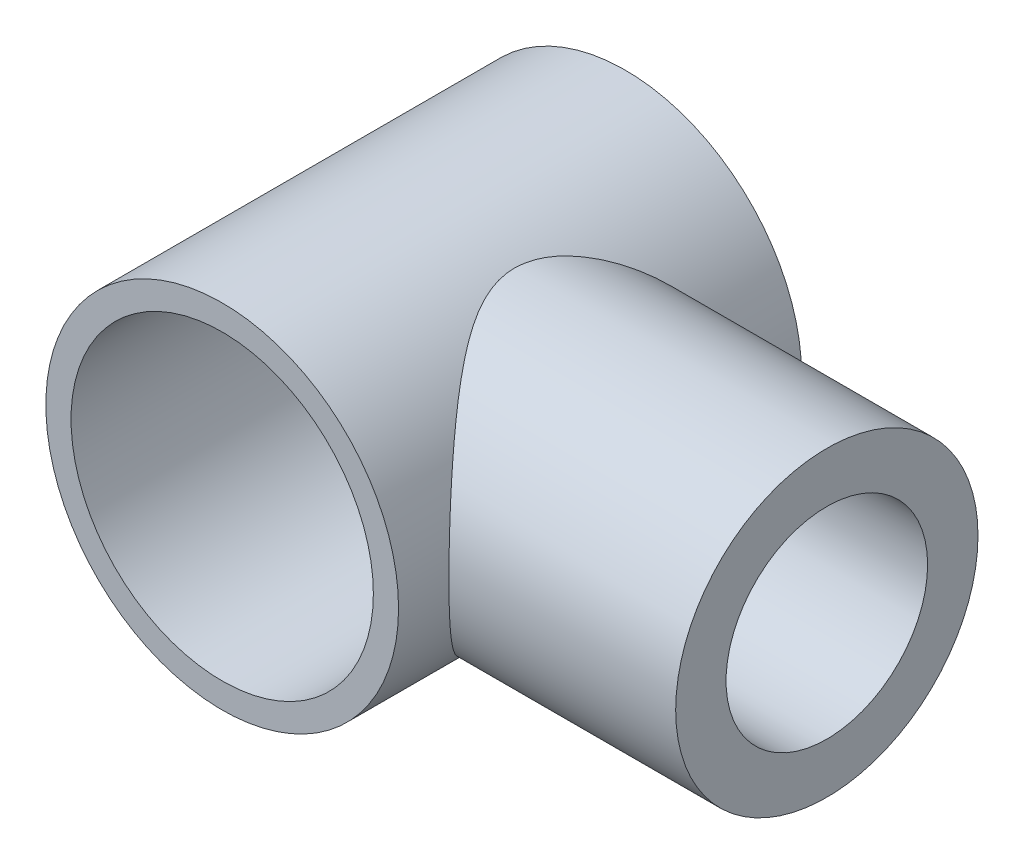
ISO-10303-21;
HEADER;
FILE_DESCRIPTION(('STEP AP214'),'2;1');
FILE_NAME('part.step','',(''),(''),'','','');
FILE_SCHEMA(('AUTOMOTIVE_DESIGN { 1 0 10303 214 1 1 1 1 }'));
ENDSEC;
DATA;
#1=APPLICATION_CONTEXT('core data for automotive mechanical design processes');
#2=APPLICATION_PROTOCOL_DEFINITION('international standard','automotive_design',2000,#1);
#3=PRODUCT_CONTEXT('',#1,'mechanical');
#4=PRODUCT('Part','Part','',(#3));
#5=PRODUCT_RELATED_PRODUCT_CATEGORY('part','',(#4));
#6=PRODUCT_DEFINITION_FORMATION('','',#4);
#7=PRODUCT_DEFINITION_CONTEXT('part definition',#1,'design');
#8=PRODUCT_DEFINITION('design','',#6,#7);
#9=PRODUCT_DEFINITION_SHAPE('','',#8);
#10=(LENGTH_UNIT() NAMED_UNIT(*) SI_UNIT(.MILLI.,.METRE.));
#11=(NAMED_UNIT(*) PLANE_ANGLE_UNIT() SI_UNIT($,.RADIAN.));
#12=(NAMED_UNIT(*) SI_UNIT($,.STERADIAN.) SOLID_ANGLE_UNIT());
#13=UNCERTAINTY_MEASURE_WITH_UNIT(LENGTH_MEASURE(1.E-05),#10,'distance_accuracy_value','');
#14=(GEOMETRIC_REPRESENTATION_CONTEXT(3) GLOBAL_UNCERTAINTY_ASSIGNED_CONTEXT((#13)) GLOBAL_UNIT_ASSIGNED_CONTEXT((#10,
#11,#12)) REPRESENTATION_CONTEXT('',''));
#15=CARTESIAN_POINT('',(0.,0.,0.));
#16=DIRECTION('',(0.,0.,1.));
#17=DIRECTION('',(1.,0.,0.));
#18=AXIS2_PLACEMENT_3D('',#15,#16,#17);
#19=CARTESIAN_POINT('',(50.8,0.,0.));
#20=DIRECTION('',(-1.,0.,0.));
#21=DIRECTION('',(0.,0.,1.));
#22=AXIS2_PLACEMENT_3D('',#19,#20,#21);
#23=CYLINDRICAL_SURFACE('',#22,19.05);
#24=CARTESIAN_POINT('',(50.8,0.,0.));
#25=DIRECTION('',(1.,0.,0.));
#26=DIRECTION('',(0.,0.,-1.));
#27=AXIS2_PLACEMENT_3D('',#24,#25,#26);
#28=CIRCLE('',#27,19.05);
#29=CARTESIAN_POINT('',(50.8,0.,-19.05));
#30=VERTEX_POINT('',#29);
#31=EDGE_CURVE('E52',#30,#30,#28,.T.);
#32=ORIENTED_EDGE('',*,*,#31,.F.);
#33=EDGE_LOOP('',(#32));
#34=FACE_BOUND('',#33,.T.);
#35=CARTESIAN_POINT('',(22.225,0.,19.05));
#36=CARTESIAN_POINT('',(22.2249963510652,0.448563703535865,19.0499962681765));
#37=CARTESIAN_POINT('',(22.2113899679366,0.897189152138415,19.0341270225542));
#38=CARTESIAN_POINT('',(22.1572721033992,1.79062148804766,18.9709472965141));
#39=CARTESIAN_POINT('',(22.1167556248665,2.23542765058187,18.9236309764678));
#40=CARTESIAN_POINT('',(22.0097060527991,3.11787786363935,18.7984066168343));
#41=CARTESIAN_POINT('',(21.9431526317819,3.55551603918132,18.7204746749133));
#42=CARTESIAN_POINT('',(21.7854826169591,4.42000646916787,18.5354113126392));
#43=CARTESIAN_POINT('',(21.6943665939284,4.84685897399305,18.4282805707944));
#44=CARTESIAN_POINT('',(21.4900564570249,5.68443309918823,18.187315756837));
#45=CARTESIAN_POINT('',(21.3770044632264,6.09523912970324,18.053653457166));
#46=CARTESIAN_POINT('',(21.1305208043592,6.90140642309321,17.7611089233733));
#47=CARTESIAN_POINT('',(20.9970894538204,7.29676792421692,17.6022270784822));
#48=CARTESIAN_POINT('',(20.712014826878,8.07050639937623,17.2611760810917));
#49=CARTESIAN_POINT('',(20.5603702546023,8.44888216224095,17.0790052715213));
#50=CARTESIAN_POINT('',(20.2410764396617,9.18757007987839,16.6932548296511));
#51=CARTESIAN_POINT('',(20.0734237206864,9.54787828509391,16.4896705462471));
#52=CARTESIAN_POINT('',(19.658060683619,10.3828441818933,15.9818641214663));
#53=CARTESIAN_POINT('',(19.4041073632835,10.8490278480277,15.6687627167791));
#54=CARTESIAN_POINT('',(18.8755029884987,11.7446423151025,15.0091783599816));
#55=CARTESIAN_POINT('',(18.6008446747211,12.17406011189,14.6626836879707));
#56=CARTESIAN_POINT('',(18.0356245352995,12.9967886032243,13.9386865019689));
#57=CARTESIAN_POINT('',(17.7450262023869,13.3900103743175,13.5611117241623));
#58=CARTESIAN_POINT('',(17.1540033282107,14.1392511095508,12.7780181427311));
#59=CARTESIAN_POINT('',(16.8535800828858,14.4952749544422,12.3725030167843));
#60=CARTESIAN_POINT('',(16.2424062033248,15.1772421870853,11.5262803882765));
#61=CARTESIAN_POINT('',(15.9315696807841,15.5024292728783,11.0850260290406));
#62=CARTESIAN_POINT('',(15.3122180874907,16.114468517878,10.1748369565258));
#63=CARTESIAN_POINT('',(15.0037038115743,16.401308068869,9.70589321200692));
#64=CARTESIAN_POINT('',(14.3980991524055,16.9354056781552,8.7406109920939));
#65=CARTESIAN_POINT('',(14.1009859885895,17.1827461647377,8.24433255158797));
#66=CARTESIAN_POINT('',(13.528556687588,17.636944703405,7.22173120423745));
#67=CARTESIAN_POINT('',(13.253223079006,17.8438354041785,6.69543297456324));
#68=CARTESIAN_POINT('',(12.8608078238047,18.1267327527172,5.86647816666379));
#69=CARTESIAN_POINT('',(12.7303481706489,18.2184393103615,5.57545172985251));
#70=CARTESIAN_POINT('',(12.4826481344027,18.3890369388024,4.98403133879362));
#71=CARTESIAN_POINT('',(12.3654095867936,18.4679262308514,4.68363609124928));
#72=CARTESIAN_POINT('',(12.1476571278415,18.6118804054173,4.07409992588955));
#73=CARTESIAN_POINT('',(12.047117438432,18.6769666395725,3.76497336634904));
#74=CARTESIAN_POINT('',(11.8662151944698,18.792421164367,3.13828511556138));
#75=CARTESIAN_POINT('',(11.7858418612479,18.8427973197311,2.82072803112753));
#76=CARTESIAN_POINT('',(11.6477452551469,18.9284814238064,2.17332105743714));
#77=CARTESIAN_POINT('',(11.5903982605838,18.9635398148935,1.84335636675644));
#78=CARTESIAN_POINT('',(11.5033999950561,19.0164415189307,1.17840105169739));
#79=CARTESIAN_POINT('',(11.4737454379175,19.0342868745056,0.843411028454214));
#80=CARTESIAN_POINT('',(11.4440074651122,19.0521818755503,0.17192057478469));
#81=CARTESIAN_POINT('',(11.4438978876302,19.0522472650215,-0.164578255519678));
#82=CARTESIAN_POINT('',(11.4731974290653,19.0346171667709,-0.835800549840466));
#83=CARTESIAN_POINT('',(11.5026060679888,19.0169219678528,-1.17052404263654));
#84=CARTESIAN_POINT('',(11.5823977196988,18.9684066016985,-1.7836972156989));
#85=CARTESIAN_POINT('',(11.6288496592692,18.9400295434889,-2.06286919974233));
#86=CARTESIAN_POINT('',(11.7396419616693,18.8715572973168,-2.61622265929752));
#87=CARTESIAN_POINT('',(11.8039887737942,18.8314578843616,-2.89040229754347));
#88=CARTESIAN_POINT('',(12.0207046075918,18.6944496125996,-3.70444010265541));
#89=CARTESIAN_POINT('',(12.1966805342794,18.5808701183469,-4.23532160156338));
#90=CARTESIAN_POINT('',(12.5756582873144,18.3262320245863,-5.22395215945325));
#91=CARTESIAN_POINT('',(12.7749617181848,18.1884362289949,-5.68404039904576));
#92=CARTESIAN_POINT('',(13.1991677618079,17.8829804029984,-6.58229165421004));
#93=CARTESIAN_POINT('',(13.4240903883106,17.7152969657659,-7.02043713805356));
#94=CARTESIAN_POINT('',(13.8910508285684,17.3515757356333,-7.8766914608841));
#95=CARTESIAN_POINT('',(14.1331285270308,17.1554706797752,-8.29474954484415));
#96=CARTESIAN_POINT('',(14.6270566375729,16.7363314171061,-9.11087456612661));
#97=CARTESIAN_POINT('',(14.8789046060304,16.5133039147197,-9.5089464457408));
#98=CARTESIAN_POINT('',(15.4077195319539,16.0216571192137,-10.3174921810685));
#99=CARTESIAN_POINT('',(15.6850690253758,15.750808338944,-10.7263597521015));
#100=CARTESIAN_POINT('',(16.2396571954695,15.1783745757433,-11.5221378204265));
#101=CARTESIAN_POINT('',(16.5168958572486,14.8767863324173,-11.9090459817941));
#102=CARTESIAN_POINT('',(17.0662997426743,14.2431634176716,-12.6600103065588));
#103=CARTESIAN_POINT('',(17.3384701332829,13.9111620567677,-13.0240907530513));
#104=CARTESIAN_POINT('',(17.8737893298288,13.2163015826379,-13.7286795053856));
#105=CARTESIAN_POINT('',(18.1369388898896,12.8534450577127,-14.0691897840844));
#106=CARTESIAN_POINT('',(18.6372201291738,12.1158212052285,-14.7083428006703));
#107=CARTESIAN_POINT('',(18.8749947122247,11.7425714223872,-15.0082300126255));
#108=CARTESIAN_POINT('',(19.335187715752,10.9683171296682,-15.583035753552));
#109=CARTESIAN_POINT('',(19.5576056544783,10.5673117498653,-15.8579534992971));
#110=CARTESIAN_POINT('',(19.9833199390026,9.73829593620121,-16.3801031556805));
#111=CARTESIAN_POINT('',(20.1866287775329,9.31030345555637,-16.6273531747609));
#112=CARTESIAN_POINT('',(20.4744573428778,8.64899189767862,-16.9752614565721));
#113=CARTESIAN_POINT('',(20.5675408176442,8.425344171794,-17.0873988073562));
#114=CARTESIAN_POINT('',(20.7475764959237,7.97171597230317,-17.3036817025003));
#115=CARTESIAN_POINT('',(20.8345271003042,7.74173386859926,-17.4078251630911));
#116=CARTESIAN_POINT('',(21.0558476766709,7.12515973212647,-17.6722583391836));
#117=CARTESIAN_POINT('',(21.1845577264888,6.73338795245934,-17.8253494029047));
#118=CARTESIAN_POINT('',(21.4218847624416,5.93521727633252,-18.1067593796727));
#119=CARTESIAN_POINT('',(21.5305056620195,5.52882124719761,-18.2350831177017));
#120=CARTESIAN_POINT('',(21.725710775026,4.70358998876465,-18.4651588492769));
#121=CARTESIAN_POINT('',(21.8123060951188,4.28476114832549,-18.5669242358694));
#122=CARTESIAN_POINT('',(21.9618382483905,3.43707716866783,-18.742367006478));
#123=CARTESIAN_POINT('',(22.0247748441818,3.00822192889208,-18.8160441086613));
#124=CARTESIAN_POINT('',(22.1259031330844,2.14154874604599,-18.9343183517505));
#125=CARTESIAN_POINT('',(22.1639783276702,1.70369838482268,-18.9787785909363));
#126=CARTESIAN_POINT('',(22.2140663771637,0.824472530247733,-19.0372489740817));
#127=CARTESIAN_POINT('',(22.2260791663226,0.383097028005887,-19.0512590412234));
#128=CARTESIAN_POINT('',(22.2237684769626,-0.499477819681567,-19.0485632091656));
#129=CARTESIAN_POINT('',(22.2094456247948,-0.94067716906707,-19.031858040479));
#130=CARTESIAN_POINT('',(22.1547903738637,-1.8192257742203,-18.9680490086781));
#131=CARTESIAN_POINT('',(22.1144590097153,-2.25657518243664,-18.9209463547712));
#132=CARTESIAN_POINT('',(22.0125608315837,-3.09222189892728,-18.8017442542838));
#133=CARTESIAN_POINT('',(21.9527626911999,-3.49103611355891,-18.7317247669453));
#134=CARTESIAN_POINT('',(21.8126893418756,-4.27991674572959,-18.5673676035051));
#135=CARTESIAN_POINT('',(21.7324153618196,-4.66998368671991,-18.4730313868005));
#136=CARTESIAN_POINT('',(21.552743689174,-5.43929452393457,-18.2613189420487));
#137=CARTESIAN_POINT('',(21.4533451844587,-5.81853795975161,-18.1439417355585));
#138=CARTESIAN_POINT('',(21.236972131825,-6.56448701151628,-17.8875818592715));
#139=CARTESIAN_POINT('',(21.1199964841095,-6.93119184116297,-17.7485978375233));
#140=CARTESIAN_POINT('',(20.8600061828521,-7.67985967289831,-17.4384476205953));
#141=CARTESIAN_POINT('',(20.7156500054905,-8.06065362266362,-17.265586759562));
#142=CARTESIAN_POINT('',(20.4104950150152,-8.80477538921098,-16.8982435913781));
#143=CARTESIAN_POINT('',(20.249695758628,-9.16810273473895,-16.7037607013274));
#144=CARTESIAN_POINT('',(19.9137115507011,-9.87666592894649,-16.2948269442224));
#145=CARTESIAN_POINT('',(19.7385190521258,-10.2218921289426,-16.0803655935543));
#146=CARTESIAN_POINT('',(19.375912366701,-10.8935940082,-15.6331369757212));
#147=CARTESIAN_POINT('',(19.1884957125362,-11.2200658769348,-15.400366010991));
#148=CARTESIAN_POINT('',(18.7064441696691,-12.0137645790509,-14.7963132831968));
#149=CARTESIAN_POINT('',(18.4053736447526,-12.469013152051,-14.4143443622767));
#150=CARTESIAN_POINT('',(17.786982369731,-13.3363325396783,-13.6158917046143));
#151=CARTESIAN_POINT('',(17.469654067546,-13.748383012134,-13.1993918709698));
#152=CARTESIAN_POINT('',(16.825038142109,-14.5301704699835,-12.3335949201064));
#153=CARTESIAN_POINT('',(16.4977315199918,-14.8998194086659,-11.8842326209638));
#154=CARTESIAN_POINT('',(15.8412781188537,-15.5959336681889,-10.9547481843057));
#155=CARTESIAN_POINT('',(15.5121319702853,-15.9224129392521,-10.4746360583677));
#156=CARTESIAN_POINT('',(14.9352703839703,-16.4622832249793,-9.59671781504496));
#157=CARTESIAN_POINT('',(14.6861523042259,-16.68445882894,-9.2052098869425));
#158=CARTESIAN_POINT('',(14.1969874386344,-17.1026206338377,-8.40283547349731));
#159=CARTESIAN_POINT('',(13.9569419182219,-17.2986031909835,-7.99196630548697));
#160=CARTESIAN_POINT('',(13.4929125897518,-17.6629183470738,-7.15075516249884));
#161=CARTESIAN_POINT('',(13.2688909033422,-17.8313174547096,-6.72046331599746));
#162=CARTESIAN_POINT('',(12.8447557806373,-18.1392254505354,-5.83859886533086));
#163=CARTESIAN_POINT('',(12.6446274848692,-18.2787523345814,-5.3870397337157));
#164=CARTESIAN_POINT('',(12.2381453219272,-18.5540121987693,-4.35813654347652));
#165=CARTESIAN_POINT('',(12.0402798762374,-18.6820206213681,-3.77512954158565));
#166=CARTESIAN_POINT('',(11.8006726115699,-18.8335801237832,-2.87930828732603));
#167=CARTESIAN_POINT('',(11.7303700258849,-18.8773381884337,-2.57740872619462));
#168=CARTESIAN_POINT('',(11.6116324686458,-18.9506067671227,-1.96754236791002));
#169=CARTESIAN_POINT('',(11.5631966778349,-18.98011781494,-1.65957579851334));
#170=CARTESIAN_POINT('',(11.4902458286574,-19.0243725717596,-1.03648067165628));
#171=CARTESIAN_POINT('',(11.4659835759472,-19.038960254362,-0.721310976584323));
#172=CARTESIAN_POINT('',(11.4436269483862,-19.0524068203758,-0.089709602520213));
#173=CARTESIAN_POINT('',(11.4455310926831,-19.0512665938873,0.226722004042507));
#174=CARTESIAN_POINT('',(11.4754073331094,-19.0332851516952,0.858136705012175));
#175=CARTESIAN_POINT('',(11.5034002229676,-19.0164314117155,1.17311844254743));
#176=CARTESIAN_POINT('',(11.5839189363464,-18.9674887930959,1.79871699996022));
#177=CARTESIAN_POINT('',(11.6364488524906,-18.9353973728906,2.10933308276736));
#178=CARTESIAN_POINT('',(11.775524758836,-18.8492845581772,2.78262783868595));
#179=CARTESIAN_POINT('',(11.86664016503,-18.7922531040758,3.14397250738528));
#180=CARTESIAN_POINT('',(12.0746525688286,-18.6592755990207,3.85552732342316));
#181=CARTESIAN_POINT('',(12.1915569558233,-18.5833241260525,4.2057342464579));
#182=CARTESIAN_POINT('',(12.4462192128305,-18.4137363712745,4.89522811201662));
#183=CARTESIAN_POINT('',(12.5840385782907,-18.3200477295977,5.23447915104726));
#184=CARTESIAN_POINT('',(12.8755463803548,-18.1163630945112,5.90095825647749));
#185=CARTESIAN_POINT('',(13.0292355516934,-18.0063663459716,6.22818576526408));
#186=CARTESIAN_POINT('',(13.4560125816411,-17.6916957995886,7.08766036688553));
#187=CARTESIAN_POINT('',(13.7397989137998,-17.4731534838867,7.60954951280721));
#188=CARTESIAN_POINT('',(14.3262557561536,-16.9956596051598,8.62347005610092));
#189=CARTESIAN_POINT('',(14.6289381913608,-16.7366823664141,9.11548220428888));
#190=CARTESIAN_POINT('',(15.243219131411,-16.1792213479137,10.0718386848146));
#191=CARTESIAN_POINT('',(15.5548291199286,-15.880684712931,10.5361447738523));
#192=CARTESIAN_POINT('',(16.1785019361547,-15.2448385772202,11.4368340855829));
#193=CARTESIAN_POINT('',(16.4905646433416,-14.9075380025126,11.8732237006098));
#194=CARTESIAN_POINT('',(17.12365986282,-14.1765975265133,12.7382325545377));
#195=CARTESIAN_POINT('',(17.4443886267531,-13.7810133664348,13.1654373115905));
#196=CARTESIAN_POINT('',(18.0722508199811,-12.9467030064155,13.9867113604958));
#197=CARTESIAN_POINT('',(18.3793815556676,-12.507968313822,14.3807741010917));
#198=CARTESIAN_POINT('',(18.972605709552,-11.5883291178875,15.1315699807292));
#199=CARTESIAN_POINT('',(19.2587470904351,-11.1075266358208,15.4883890685121));
#200=CARTESIAN_POINT('',(19.66741553588,-10.354946741676,15.9927717682558));
#201=CARTESIAN_POINT('',(19.8001953097737,-10.0988997851152,16.1557353387449));
#202=CARTESIAN_POINT('',(20.0581240744088,-9.57638613058905,16.4708354914515));
#203=CARTESIAN_POINT('',(20.1832713041667,-9.30991705112914,16.6229695764293));
#204=CARTESIAN_POINT('',(20.4711977636986,-8.66310488009764,16.9715888241881));
#205=CARTESIAN_POINT('',(20.6300846990589,-8.27815502240235,17.1628089758884));
#206=CARTESIAN_POINT('',(20.9290453122642,-7.49020610749757,17.5210314588184));
#207=CARTESIAN_POINT('',(21.0691238363296,-7.08721173550466,17.6880400293497));
#208=CARTESIAN_POINT('',(21.327994615724,-6.2651980575774,17.995613834136));
#209=CARTESIAN_POINT('',(21.446812861353,-5.84619908834643,18.1362113660314));
#210=CARTESIAN_POINT('',(21.6611186634393,-4.99394573076896,18.3891395610098));
#211=CARTESIAN_POINT('',(21.7566105557866,-4.56069400873093,18.5014754774631));
#212=CARTESIAN_POINT('',(21.902543254866,-3.78748397260374,18.6728351067213));
#213=CARTESIAN_POINT('',(21.9582969888969,-3.44991096205714,18.7381838802984));
#214=CARTESIAN_POINT('',(22.054444082545,-2.76950407219213,18.8507623223174));
#215=CARTESIAN_POINT('',(22.0948347186931,-2.42666927129426,18.8979887781668));
#216=CARTESIAN_POINT('',(22.1596913990136,-1.73739342002838,18.9737761913043));
#217=CARTESIAN_POINT('',(22.1841553608126,-1.39095190410515,19.0023347078073));
#218=CARTESIAN_POINT('',(22.2168092767771,-0.696352395729682,19.0404459575191));
#219=CARTESIAN_POINT('',(22.2250028324631,-0.348194800247481,19.0500028968049));
#220=CARTESIAN_POINT('',(22.225,0.,19.05));
#221=B_SPLINE_CURVE_WITH_KNOTS('',3,(#35,#36,#37,#38,#39,#40,#41,#42,#43,#44,#45,#46,#47,#48,
#49,#50,#51,#52,#53,#54,#55,#56,#57,#58,#59,#60,#61,#62,#63,#64,#65,#66,#67,#68,#69,#70,#71,#72,
#73,#74,#75,#76,#77,#78,#79,#80,#81,#82,#83,#84,#85,#86,#87,#88,#89,#90,#91,#92,#93,#94,#95,#96,
#97,#98,#99,#100,#101,#102,#103,#104,#105,#106,#107,#108,#109,#110,#111,#112,#113,#114,#115,
#116,#117,#118,#119,#120,#121,#122,#123,#124,#125,#126,#127,#128,#129,#130,#131,#132,#133,#134,
#135,#136,#137,#138,#139,#140,#141,#142,#143,#144,#145,#146,#147,#148,#149,#150,#151,#152,#153,
#154,#155,#156,#157,#158,#159,#160,#161,#162,#163,#164,#165,#166,#167,#168,#169,#170,#171,#172,
#173,#174,#175,#176,#177,#178,#179,#180,#181,#182,#183,#184,#185,#186,#187,#188,#189,#190,#191,
#192,#193,#194,#195,#196,#197,#198,#199,#200,#201,#202,#203,#204,#205,#206,#207,#208,#209,#210,
#211,#212,#213,#214,#215,#216,#217,#218,#219,#220),.UNSPECIFIED.,.T.,.F.,(4,2,2,2,2,2,2,2,2,2,2,
2,2,2,2,2,2,2,2,2,2,2,2,2,2,2,2,2,2,2,2,2,2,2,2,2,2,2,2,2,2,2,2,2,2,2,2,2,2,2,2,2,2,2,2,2,2,2,2,
2,2,2,2,2,2,2,2,2,2,2,2,2,2,2,2,2,2,2,2,2,2,2,2,2,2,2,2,2,2,2,2,2,4),(0.,1.34531639816823,
2.69088268743035,4.03750158626212,5.38408919565445,6.72222741409177,8.06034498212703,
9.39855781379145,10.7370619139886,12.58334301784,14.430274479786,16.2816285582196,
18.1327394140481,20.0213843685889,21.9106487680491,23.7959175442687,25.6796583028112,
26.674699916367,27.6698795015591,28.6635082524103,29.6566047841425,30.6653268995963,
31.6739292979664,32.6816385849971,33.6893314860126,34.5417200966524,35.3944163063443,
37.1012408970593,38.6591226340686,40.2182298470916,41.7810890118098,43.3435597817052,
45.0325635363556,46.7217466227414,48.4091012306678,50.0963144333809,51.6986478598523,
53.3010315299544,54.9023602339012,55.7029564192035,56.5037605923352,57.8219700423291,
59.1399224290041,60.4572088987778,61.7745085856185,63.0979375581845,64.4213698694194,
65.744770705343,67.0681188998239,68.2946890244679,69.521185552201,70.7477341747818,
71.9743595741675,73.3003142277406,74.6263046359034,75.9529948141233,77.2799536042434,
79.2756269339225,81.2722358529638,83.272918417332,85.272952875398,86.8154347261415,
88.3581309331821,89.8970508477013,91.4350086555852,93.3145303402376,94.2527355039131,
95.1909055140735,96.1387869958929,97.086614833844,98.0351987735264,98.9839409876488,
100.113126065117,101.242635112433,102.375531965995,103.508481293555,105.404508045784,
107.301743687155,109.201540273182,111.100900273715,113.092800038307,115.085092625263,
117.07268083737,118.066165164593,119.059877848459,120.43328703126,121.806341656278,
123.177706105295,124.548815451518,125.593018672542,126.637406916883,127.681931685006,
128.726225217535),.UNSPECIFIED.);
#222=CARTESIAN_POINT('',(22.225,0.,19.05));
#223=VERTEX_POINT('',#222);
#224=EDGE_CURVE('E10',#223,#223,#221,.T.);
#225=ORIENTED_EDGE('',*,*,#224,.F.);
#226=EDGE_LOOP('',(#225));
#227=FACE_BOUND('',#226,.T.);
#228=ADVANCED_FACE('F39',(#34,#227),#23,.T.);
#229=CARTESIAN_POINT('',(50.8,0.,0.));
#230=DIRECTION('',(-1.,0.,0.));
#231=DIRECTION('',(0.,0.,1.));
#232=AXIS2_PLACEMENT_3D('',#229,#230,#231);
#233=CYLINDRICAL_SURFACE('',#232,12.7);
#234=CARTESIAN_POINT('',(50.8,0.,0.));
#235=DIRECTION('',(1.,0.,0.));
#236=DIRECTION('',(0.,0.,-1.));
#237=AXIS2_PLACEMENT_3D('',#234,#235,#236);
#238=CIRCLE('',#237,12.7);
#239=CARTESIAN_POINT('',(50.8,0.,-12.7));
#240=VERTEX_POINT('',#239);
#241=EDGE_CURVE('E57',#240,#240,#238,.T.);
#242=ORIENTED_EDGE('',*,*,#241,.T.);
#243=EDGE_LOOP('',(#242));
#244=FACE_BOUND('',#243,.T.);
#245=CARTESIAN_POINT('',(19.05,0.,-12.7));
#246=CARTESIAN_POINT('',(19.0499999149557,-0.319044351827433,-12.6999999178946));
#247=CARTESIAN_POINT('',(19.041968060588,-0.638090286445418,-12.6879616001765));
#248=CARTESIAN_POINT('',(19.0100429113742,-1.27357416889368,-12.6399980296532));
#249=CARTESIAN_POINT('',(18.9861495330445,-1.59001210298844,-12.6040726511236));
#250=CARTESIAN_POINT('',(18.9230795112656,-2.21792085178076,-12.5088651833196));
#251=CARTESIAN_POINT('',(18.8838969102271,-2.52938968091531,-12.4495739892458));
#252=CARTESIAN_POINT('',(18.7911802647186,-3.14498780586516,-12.3084840957078));
#253=CARTESIAN_POINT('',(18.7376460467142,-3.44911701288404,-12.2266851240877));
#254=CARTESIAN_POINT('',(18.6177206611583,-4.04665380134025,-12.042089505447));
#255=CARTESIAN_POINT('',(18.551392136999,-4.34010566223851,-11.9393950376442));
#256=CARTESIAN_POINT('',(18.4071052568794,-4.91621490193225,-11.7139457330231));
#257=CARTESIAN_POINT('',(18.3291469610881,-5.19887233656537,-11.5911909999903));
#258=CARTESIAN_POINT('',(18.1631367051315,-5.75207432701854,-11.3268535757942));
#259=CARTESIAN_POINT('',(18.0750863641369,-6.02262081626361,-11.1852739043278));
#260=CARTESIAN_POINT('',(17.890458352108,-6.55074759818101,-10.8843977456393));
#261=CARTESIAN_POINT('',(17.7938775100723,-6.80832301284097,-10.7250946644196));
#262=CARTESIAN_POINT('',(17.5854082661757,-7.33086574145447,-10.3757108500479));
#263=CARTESIAN_POINT('',(17.4729161377666,-7.59461321173192,-10.1841663070463));
#264=CARTESIAN_POINT('',(17.2420675803482,-8.10506530257835,-9.78280879055701));
#265=CARTESIAN_POINT('',(17.1237109886303,-8.35176944982775,-9.57299531007802));
#266=CARTESIAN_POINT('',(16.8831992824099,-8.82787123192345,-9.13582470289683));
#267=CARTESIAN_POINT('',(16.7610388349219,-9.05724286741398,-8.90844221631568));
#268=CARTESIAN_POINT('',(16.5154631225222,-9.49765992068987,-8.43732333395075));
#269=CARTESIAN_POINT('',(16.3920481088713,-9.70870893033224,-8.19359016013983));
#270=CARTESIAN_POINT('',(16.1269912795642,-10.1438339769357,-7.65062453984433));
#271=CARTESIAN_POINT('',(15.9855513078686,-10.3646977289022,-7.34870853652963));
#272=CARTESIAN_POINT('',(15.7084356410373,-10.7800697399961,-6.7246282637438));
#273=CARTESIAN_POINT('',(15.5727612595663,-10.9745720146433,-6.4024594207697));
#274=CARTESIAN_POINT('',(15.3120771580104,-11.3354426882506,-5.73933798824068));
#275=CARTESIAN_POINT('',(15.1870504300321,-11.5018563882181,-5.39841684299923));
#276=CARTESIAN_POINT('',(14.9525421661918,-11.8051159191697,-4.69836689520345));
#277=CARTESIAN_POINT('',(14.8430611914586,-11.9419606829468,-4.33923743604889));
#278=CARTESIAN_POINT('',(14.6737887971171,-12.148859028084,-3.71090841112694));
#279=CARTESIAN_POINT('',(14.6087779778262,-12.2267886352654,-3.44568727600369));
#280=CARTESIAN_POINT('',(14.4914306450491,-12.3656463418972,-2.90822033819586));
#281=CARTESIAN_POINT('',(14.4390859954181,-12.4265853591448,-2.63597916989363));
#282=CARTESIAN_POINT('',(14.348894521881,-12.5306215699129,-2.08607784405444));
#283=CARTESIAN_POINT('',(14.3110297415313,-12.5737408670083,-1.80842484995687));
#284=CARTESIAN_POINT('',(14.2511622433023,-12.6415558604093,-1.24915768342005));
#285=CARTESIAN_POINT('',(14.2291596123524,-12.6662514557473,-0.967543489280845));
#286=CARTESIAN_POINT('',(14.2018752005732,-12.6968370696706,-0.401303384389314));
#287=CARTESIAN_POINT('',(14.1966630383679,-12.7026487905648,-0.11666983119373));
#288=CARTESIAN_POINT('',(14.2033816794798,-12.695135759999,0.452139536474313));
#289=CARTESIAN_POINT('',(14.2153125410287,-12.6818109435356,0.736315349388631));
#290=CARTESIAN_POINT('',(14.2558189324113,-12.63625913706,1.30214668238538));
#291=CARTESIAN_POINT('',(14.2844068298005,-12.6040181019651,1.58380017174526));
#292=CARTESIAN_POINT('',(14.357069745187,-12.5211847753435,2.14234802376761));
#293=CARTESIAN_POINT('',(14.4011450585547,-12.470592133821,2.41924229555837));
#294=CARTESIAN_POINT('',(14.5008617434374,-12.3544761806586,2.95440977540902));
#295=CARTESIAN_POINT('',(14.5559009500699,-12.2897177147741,3.21296322499923));
#296=CARTESIAN_POINT('',(14.6769594426603,-12.1448862980872,3.72318316530469));
#297=CARTESIAN_POINT('',(14.7429822780439,-12.0648083954582,3.97484739901302));
#298=CARTESIAN_POINT('',(14.8842370446744,-11.8901049878849,4.47039533264356));
#299=CARTESIAN_POINT('',(14.9594690117088,-11.7954794264068,4.71427900232517));
#300=CARTESIAN_POINT('',(15.1173998256832,-11.592379837334,5.19369955338452));
#301=CARTESIAN_POINT('',(15.2000989778942,-11.4839052434926,5.429236092969));
#302=CARTESIAN_POINT('',(15.3887310058595,-11.2302825549988,5.93863252708919));
#303=CARTESIAN_POINT('',(15.4959665818437,-11.0821640136153,6.21053379024358));
#304=CARTESIAN_POINT('',(15.7161179031399,-10.7676822582035,6.74107683918443));
#305=CARTESIAN_POINT('',(15.829033070871,-10.6013208973393,6.99971996786488));
#306=CARTESIAN_POINT('',(16.058224949471,-10.2508438822787,7.50363220060206));
#307=CARTESIAN_POINT('',(16.1745055279823,-10.0667071827702,7.74888489973563));
#308=CARTESIAN_POINT('',(16.4080174089175,-9.68143701029362,8.22518161231107));
#309=CARTESIAN_POINT('',(16.525248774024,-9.48030240833244,8.45622468019186));
#310=CARTESIAN_POINT('',(16.7837163834044,-9.01633250153976,8.95178685885655));
#311=CARTESIAN_POINT('',(16.9246742415276,-8.74954821141177,9.21277245872227));
#312=CARTESIAN_POINT('',(17.2012588585807,-8.19243189886495,9.71153228264538));
#313=CARTESIAN_POINT('',(17.3368846334086,-7.90209555963249,9.94930223386844));
#314=CARTESIAN_POINT('',(17.5992409697553,-7.29912570388165,10.3997240866172));
#315=CARTESIAN_POINT('',(17.7259780204629,-6.98650879659962,10.6123943911749));
#316=CARTESIAN_POINT('',(17.9673044475892,-6.3401406960209,11.0107509245687));
#317=CARTESIAN_POINT('',(18.0818971641012,-6.00639535429002,11.1964445781125));
#318=CARTESIAN_POINT('',(18.2747724322506,-5.38691504029924,11.5050558516089));
#319=CARTESIAN_POINT('',(18.3557696171759,-5.10459086222092,11.6331440071965));
#320=CARTESIAN_POINT('',(18.5062654001565,-4.52870423339756,11.8691883369684));
#321=CARTESIAN_POINT('',(18.5757661520494,-4.23514390044676,11.9771482826224));
#322=CARTESIAN_POINT('',(18.7017836207441,-3.63850093619584,12.1716760582035));
#323=CARTESIAN_POINT('',(18.7583086014465,-3.33542450604258,12.2582575061615));
#324=CARTESIAN_POINT('',(18.8571698991357,-2.72145399464498,12.4090127689964));
#325=CARTESIAN_POINT('',(18.8995059978573,-2.41055979322018,12.4731862391756));
#326=CARTESIAN_POINT('',(18.9691377632047,-1.78179294641286,12.5784440542206));
#327=CARTESIAN_POINT('',(18.996366833584,-1.46389572546397,12.619426180372));
#328=CARTESIAN_POINT('',(19.034820707395,-0.824941145729576,12.6772381407808));
#329=CARTESIAN_POINT('',(19.0460454899143,-0.503883782815339,12.6940679434791));
#330=CARTESIAN_POINT('',(19.0522045898932,0.13872510760991,12.7033071008558));
#331=CARTESIAN_POINT('',(19.0471395787862,0.460276614207246,12.6957174620559));
#332=CARTESIAN_POINT('',(19.0208492602128,1.101205295587,12.6562405342416));
#333=CARTESIAN_POINT('',(18.9996246424728,1.42058256258358,12.624354282258));
#334=CARTESIAN_POINT('',(18.9436003211899,2.03226782020868,12.5398728558977));
#335=CARTESIAN_POINT('',(18.9098612177051,2.32489890402041,12.4888931992071));
#336=CARTESIAN_POINT('',(18.8295982615718,2.90417350057308,12.3670276605786));
#337=CARTESIAN_POINT('',(18.7830751285296,3.19081734935543,12.2961428990839));
#338=CARTESIAN_POINT('',(18.6781723632704,3.75647970570818,12.1352930726394));
#339=CARTESIAN_POINT('',(18.6197919592089,4.0354977155354,12.0453267655669));
#340=CARTESIAN_POINT('',(18.4922798141388,4.58448654730668,11.8472635358187));
#341=CARTESIAN_POINT('',(18.4231475004616,4.85445688642181,11.7391656473939));
#342=CARTESIAN_POINT('',(18.2708860160936,5.40020940820472,11.4987801736323));
#343=CARTESIAN_POINT('',(18.1871630742086,5.67535503466359,11.3654247712153));
#344=CARTESIAN_POINT('',(18.0105704184074,6.21304645580827,11.0806419221383));
#345=CARTESIAN_POINT('',(17.9177004292693,6.47559187101745,10.9292139316702));
#346=CARTESIAN_POINT('',(17.7244005810022,6.98734375229469,10.6093413686934));
#347=CARTESIAN_POINT('',(17.6239673585761,7.23654419868886,10.4408892141782));
#348=CARTESIAN_POINT('',(17.4172474675302,7.72083737412007,10.0880351728785));
#349=CARTESIAN_POINT('',(17.310960146828,7.95592852541687,9.90363150795997));
#350=CARTESIAN_POINT('',(17.0771108634957,8.44749054584726,9.48941008814649));
#351=CARTESIAN_POINT('',(16.948842477865,8.701463663919,9.25702204660917));
#352=CARTESIAN_POINT('',(16.6895134170715,9.18906491102797,8.77320222586825));
#353=CARTESIAN_POINT('',(16.5584523739016,9.42269033781812,8.5217679255176));
#354=CARTESIAN_POINT('',(16.2963694707963,9.8690353904855,8.00062047574539));
#355=CARTESIAN_POINT('',(16.1653476979281,10.0817407099856,7.73089502784106));
#356=CARTESIAN_POINT('',(15.9065761047634,10.485264507119,7.17408053074526));
#357=CARTESIAN_POINT('',(15.7788259513026,10.6760852203047,6.88699325967969));
#358=CARTESIAN_POINT('',(15.540546962403,11.0197028233684,6.32109654465643));
#359=CARTESIAN_POINT('',(15.4294753422065,11.1743505461842,6.04363978612872));
#360=CARTESIAN_POINT('',(15.2158323601733,11.4635626931769,5.47525270261565));
#361=CARTESIAN_POINT('',(15.1132611214871,11.5981268264122,5.18432218252211));
#362=CARTESIAN_POINT('',(14.9199086044727,11.8458215660015,4.59020000616477));
#363=CARTESIAN_POINT('',(14.8291101392456,11.9589835304229,4.28702709071961));
#364=CARTESIAN_POINT('',(14.662441550989,12.162757262777,3.66920450079333));
#365=CARTESIAN_POINT('',(14.58656799801,12.2533742131335,3.35455748296747));
#366=CARTESIAN_POINT('',(14.4650085249958,12.3964989415323,2.77302325676894));
#367=CARTESIAN_POINT('',(14.4163477325548,12.4529292409068,2.50772028903094));
#368=CARTESIAN_POINT('',(14.3328687824489,12.5489216869191,1.97195047985068));
#369=CARTESIAN_POINT('',(14.2980478266529,12.5884872433794,1.70148469382527));
#370=CARTESIAN_POINT('',(14.2435454437136,12.6501231298292,1.15728191060356));
#371=CARTESIAN_POINT('',(14.2238506830904,12.6722088685011,0.883548010882763));
#372=CARTESIAN_POINT('',(14.2003241372727,12.6985673478658,0.33453005677485));
#373=CARTESIAN_POINT('',(14.1964925835844,12.7028398285934,0.0592459798232902));
#374=CARTESIAN_POINT('',(14.2048515662273,12.6934916088718,-0.490928206801658));
#375=CARTESIAN_POINT('',(14.2170512489473,12.6798606939026,-0.765818001919353));
#376=CARTESIAN_POINT('',(14.2569974195232,12.6349285104012,-1.31299116239798));
#377=CARTESIAN_POINT('',(14.2847437799291,12.6036273867274,-1.58527454910735));
#378=CARTESIAN_POINT('',(14.3547629579246,12.523820828058,-2.12570191521708));
#379=CARTESIAN_POINT('',(14.3970516246548,12.4752966203752,-2.39384104336818));
#380=CARTESIAN_POINT('',(14.4946700634274,12.3617406007918,-2.92420202631461));
#381=CARTESIAN_POINT('',(14.5500027276897,12.2967051276345,-3.18642255464104));
#382=CARTESIAN_POINT('',(14.6882370013199,12.1314748725769,-3.77268213431228));
#383=CARTESIAN_POINT('',(14.7745561243191,12.0265291636104,-4.09458209031462));
#384=CARTESIAN_POINT('',(14.9616336605759,11.7929800056362,-4.72533757933927));
#385=CARTESIAN_POINT('',(15.0623960523769,11.664370035292,-5.03418948769489));
#386=CARTESIAN_POINT('',(15.2748294262097,11.3847676985939,-5.63807596340378));
#387=CARTESIAN_POINT('',(15.3865120243571,11.2337514077467,-5.93309531230955));
#388=CARTESIAN_POINT('',(15.6173044629006,10.9106240233759,-6.50823246109436));
#389=CARTESIAN_POINT('',(15.7364139108891,10.7385140439026,-6.78835104682867));
#390=CARTESIAN_POINT('',(15.9811861487097,10.3708171200094,-7.33808421448005));
#391=CARTESIAN_POINT('',(16.106928640749,10.1748607935095,-7.60741590487795));
#392=CARTESIAN_POINT('',(16.3599595377092,9.76282141905097,-8.1294461709004));
#393=CARTESIAN_POINT('',(16.4872479909,9.54673774123852,-8.38214422557882));
#394=CARTESIAN_POINT('',(16.740663909855,9.0950398220411,-8.87022167836564));
#395=CARTESIAN_POINT('',(16.8667910528357,8.85942032256478,-9.10559638148308));
#396=CARTESIAN_POINT('',(17.1152748733229,8.36931136011994,-9.55802611274978));
#397=CARTESIAN_POINT('',(17.2376312364538,8.11482032979568,-9.77507961604205));
#398=CARTESIAN_POINT('',(17.493254792792,7.54970254155811,-10.2195457538663));
#399=CARTESIAN_POINT('',(17.6255602874115,7.23626632101139,-10.4439585515514));
#400=CARTESIAN_POINT('',(17.878414796885,6.58682136636574,-10.8652471300945));
#401=CARTESIAN_POINT('',(17.9989620969693,6.2508093519315,-11.0621188962873));
#402=CARTESIAN_POINT('',(18.2246695158514,5.55844604424612,-11.4256886282322));
#403=CARTESIAN_POINT('',(18.3298484880972,5.2021204303976,-11.5924236255243));
#404=CARTESIAN_POINT('',(18.5216848308935,4.47127050263201,-11.8934339902577));
#405=CARTESIAN_POINT('',(18.6083487044846,4.09675263527615,-12.0277207566391));
#406=CARTESIAN_POINT('',(18.7433618107449,3.41771005618137,-12.2354341521731));
#407=CARTESIAN_POINT('',(18.7959457294468,3.11611666400259,-12.3157536955379));
#408=CARTESIAN_POINT('',(18.8869925507734,2.50581917645862,-12.454265227057));
#409=CARTESIAN_POINT('',(18.9254581509337,2.19711645143928,-12.512461442311));
#410=CARTESIAN_POINT('',(18.9873565441207,1.57494955676607,-12.6058887837498));
#411=CARTESIAN_POINT('',(19.0107983807472,1.26148836804532,-12.6411337257285));
#412=CARTESIAN_POINT('',(19.0421204426587,0.632018700559814,-12.6881898140108));
#413=CARTESIAN_POINT('',(19.0500000842355,0.316010126693862,-12.7000000813245));
#414=CARTESIAN_POINT('',(19.05,0.,-12.7));
#415=B_SPLINE_CURVE_WITH_KNOTS('',3,(#245,#246,#247,#248,#249,#250,#251,#252,#253,#254,#255,
#256,#257,#258,#259,#260,#261,#262,#263,#264,#265,#266,#267,#268,#269,#270,#271,#272,#273,#274,
#275,#276,#277,#278,#279,#280,#281,#282,#283,#284,#285,#286,#287,#288,#289,#290,#291,#292,#293,
#294,#295,#296,#297,#298,#299,#300,#301,#302,#303,#304,#305,#306,#307,#308,#309,#310,#311,#312,
#313,#314,#315,#316,#317,#318,#319,#320,#321,#322,#323,#324,#325,#326,#327,#328,#329,#330,#331,
#332,#333,#334,#335,#336,#337,#338,#339,#340,#341,#342,#343,#344,#345,#346,#347,#348,#349,#350,
#351,#352,#353,#354,#355,#356,#357,#358,#359,#360,#361,#362,#363,#364,#365,#366,#367,#368,#369,
#370,#371,#372,#373,#374,#375,#376,#377,#378,#379,#380,#381,#382,#383,#384,#385,#386,#387,#388,
#389,#390,#391,#392,#393,#394,#395,#396,#397,#398,#399,#400,#401,#402,#403,#404,#405,#406,#407,
#408,#409,#410,#411,#412,#413,#414),.UNSPECIFIED.,.T.,.F.,(4,2,2,2,2,2,2,2,2,2,2,2,2,2,2,2,2,2,
2,2,2,2,2,2,2,2,2,2,2,2,2,2,2,2,2,2,2,2,2,2,2,2,2,2,2,2,2,2,2,2,2,2,2,2,2,2,2,2,2,2,2,2,2,2,2,2,
2,2,2,2,2,2,2,2,2,2,2,2,2,2,2,2,2,2,4),(0.,0.956810761235861,1.91362655847807,2.87081556090172,
3.82801613781665,4.78064387345439,5.73326668065104,6.68573686214546,7.63856260291035,
8.6720418791852,9.70554984525728,10.7405785398537,11.7754038733455,12.9737687791915,
14.1724052791264,15.369089764079,16.5658174327634,17.4169624050969,18.2675591823323,
19.1170976896837,19.9666408527304,20.8197019883417,21.6727660216507,22.5264642485431,
23.3801787577416,24.1958922150156,25.0118697888851,25.8278505338166,26.6438646525225,
27.6259849439921,28.6080055607965,29.5912034548527,30.5744667038791,31.7698891917552,
32.9655312837401,34.1602912133796,35.35472168709,36.3150486115995,37.2751954161735,
38.2347290234317,39.1942773903645,40.1580227862112,41.1217694413613,42.0854763732667,
43.0491421744258,43.9449821115548,44.8407716326462,45.7366194835058,46.6325150654036,
47.5826127907224,48.5327391119053,49.4832904688692,50.4339479218137,51.53493371405,
52.6360654989433,53.7379451405197,54.8397121226416,55.8483172040244,56.8569368951851,
57.8640671281838,58.870965637751,59.6968309869376,60.5225292780434,61.3474988923461,
62.1724805461426,62.9979330856502,63.8233788582896,64.6497271210531,65.4762587810055,
66.5229575872972,67.5699452733485,68.6180590415182,69.6661174780249,70.7331964759551,
71.8003088776725,72.8677094322608,73.9351987382188,75.1562166249863,76.3774123148776,
77.5970970650065,78.8163527195615,79.7647809704512,80.7130279141592,81.6607035202984,
82.6084146712664),.UNSPECIFIED.);
#416=CARTESIAN_POINT('',(19.05,0.,-12.7));
#417=VERTEX_POINT('',#416);
#418=EDGE_CURVE('E43',#417,#417,#415,.T.);
#419=ORIENTED_EDGE('',*,*,#418,.T.);
#420=EDGE_LOOP('',(#419));
#421=FACE_BOUND('',#420,.T.);
#422=ADVANCED_FACE('F76',(#244,#421),#233,.F.);
#423=CARTESIAN_POINT('',(50.8,0.,0.));
#424=DIRECTION('',(1.,0.,0.));
#425=DIRECTION('',(0.,0.,-1.));
#426=AXIS2_PLACEMENT_3D('',#423,#424,#425);
#427=PLANE('',#426);
#428=ORIENTED_EDGE('',*,*,#31,.T.);
#429=EDGE_LOOP('',(#428));
#430=FACE_BOUND('',#429,.T.);
#431=ORIENTED_EDGE('',*,*,#241,.F.);
#432=EDGE_LOOP('',(#431));
#433=FACE_BOUND('',#432,.T.);
#434=ADVANCED_FACE('F72',(#430,#433),#427,.T.);
#435=CARTESIAN_POINT('',(0.,0.,25.4));
#436=DIRECTION('',(0.,0.,-1.));
#437=DIRECTION('',(-1.,0.,0.));
#438=AXIS2_PLACEMENT_3D('',#435,#436,#437);
#439=CYLINDRICAL_SURFACE('',#438,22.225);
#440=CARTESIAN_POINT('',(0.,0.,25.4));
#441=DIRECTION('',(0.,0.,1.));
#442=DIRECTION('',(1.,0.,0.));
#443=AXIS2_PLACEMENT_3D('',#440,#441,#442);
#444=CIRCLE('',#443,22.225);
#445=CARTESIAN_POINT('',(22.225,0.,25.4));
#446=VERTEX_POINT('',#445);
#447=EDGE_CURVE('E147',#446,#446,#444,.T.);
#448=ORIENTED_EDGE('',*,*,#447,.F.);
#449=EDGE_LOOP('',(#448));
#450=FACE_BOUND('',#449,.T.);
#451=CARTESIAN_POINT('',(0.,0.,-25.4));
#452=DIRECTION('',(0.,0.,1.));
#453=DIRECTION('',(1.,0.,0.));
#454=AXIS2_PLACEMENT_3D('',#451,#452,#453);
#455=CIRCLE('',#454,22.225);
#456=CARTESIAN_POINT('',(22.225,0.,-25.4));
#457=VERTEX_POINT('',#456);
#458=EDGE_CURVE('E64',#457,#457,#455,.T.);
#459=ORIENTED_EDGE('',*,*,#458,.T.);
#460=EDGE_LOOP('',(#459));
#461=FACE_BOUND('',#460,.T.);
#462=ORIENTED_EDGE('',*,*,#224,.T.);
#463=EDGE_LOOP('',(#462));
#464=FACE_BOUND('',#463,.T.);
#465=ADVANCED_FACE('F66',(#450,#461,#464),#439,.T.);
#466=CARTESIAN_POINT('',(0.,0.,25.4));
#467=DIRECTION('',(0.,0.,-1.));
#468=DIRECTION('',(-1.,0.,0.));
#469=AXIS2_PLACEMENT_3D('',#466,#467,#468);
#470=CYLINDRICAL_SURFACE('',#469,19.05);
#471=ORIENTED_EDGE('',*,*,#418,.F.);
#472=EDGE_LOOP('',(#471));
#473=FACE_BOUND('',#472,.T.);
#474=CARTESIAN_POINT('',(0.,0.,-25.4));
#475=DIRECTION('',(0.,0.,1.));
#476=DIRECTION('',(1.,0.,0.));
#477=AXIS2_PLACEMENT_3D('',#474,#475,#476);
#478=CIRCLE('',#477,19.05);
#479=CARTESIAN_POINT('',(19.05,0.,-25.4));
#480=VERTEX_POINT('',#479);
#481=EDGE_CURVE('E140',#480,#480,#478,.T.);
#482=ORIENTED_EDGE('',*,*,#481,.F.);
#483=EDGE_LOOP('',(#482));
#484=FACE_BOUND('',#483,.T.);
#485=CARTESIAN_POINT('',(0.,0.,25.4));
#486=DIRECTION('',(0.,0.,1.));
#487=DIRECTION('',(1.,0.,0.));
#488=AXIS2_PLACEMENT_3D('',#485,#486,#487);
#489=CIRCLE('',#488,19.05);
#490=CARTESIAN_POINT('',(19.05,0.,25.4));
#491=VERTEX_POINT('',#490);
#492=EDGE_CURVE('E143',#491,#491,#489,.T.);
#493=ORIENTED_EDGE('',*,*,#492,.T.);
#494=EDGE_LOOP('',(#493));
#495=FACE_BOUND('',#494,.T.);
#496=ADVANCED_FACE('F71',(#473,#484,#495),#470,.F.);
#497=CARTESIAN_POINT('',(0.,0.,25.4));
#498=DIRECTION('',(0.,0.,1.));
#499=DIRECTION('',(1.,0.,0.));
#500=AXIS2_PLACEMENT_3D('',#497,#498,#499);
#501=PLANE('',#500);
#502=ORIENTED_EDGE('',*,*,#447,.T.);
#503=EDGE_LOOP('',(#502));
#504=FACE_BOUND('',#503,.T.);
#505=ORIENTED_EDGE('',*,*,#492,.F.);
#506=EDGE_LOOP('',(#505));
#507=FACE_BOUND('',#506,.T.);
#508=ADVANCED_FACE('F100',(#504,#507),#501,.T.);
#509=CARTESIAN_POINT('',(0.,0.,-25.4));
#510=DIRECTION('',(0.,0.,1.));
#511=DIRECTION('',(1.,0.,0.));
#512=AXIS2_PLACEMENT_3D('',#509,#510,#511);
#513=PLANE('',#512);
#514=ORIENTED_EDGE('',*,*,#458,.F.);
#515=EDGE_LOOP('',(#514));
#516=FACE_BOUND('',#515,.T.);
#517=ORIENTED_EDGE('',*,*,#481,.T.);
#518=EDGE_LOOP('',(#517));
#519=FACE_BOUND('',#518,.T.);
#520=ADVANCED_FACE('F74',(#516,#519),#513,.F.);
#521=CLOSED_SHELL('',(#228,#422,#434,#465,#496,#508,#520));
#522=MANIFOLD_SOLID_BREP('B2',#521);
#523=ADVANCED_BREP_SHAPE_REPRESENTATION('',(#18,#522),#14);
#524=SHAPE_DEFINITION_REPRESENTATION(#9,#523);
ENDSEC;
END-ISO-10303-21;
